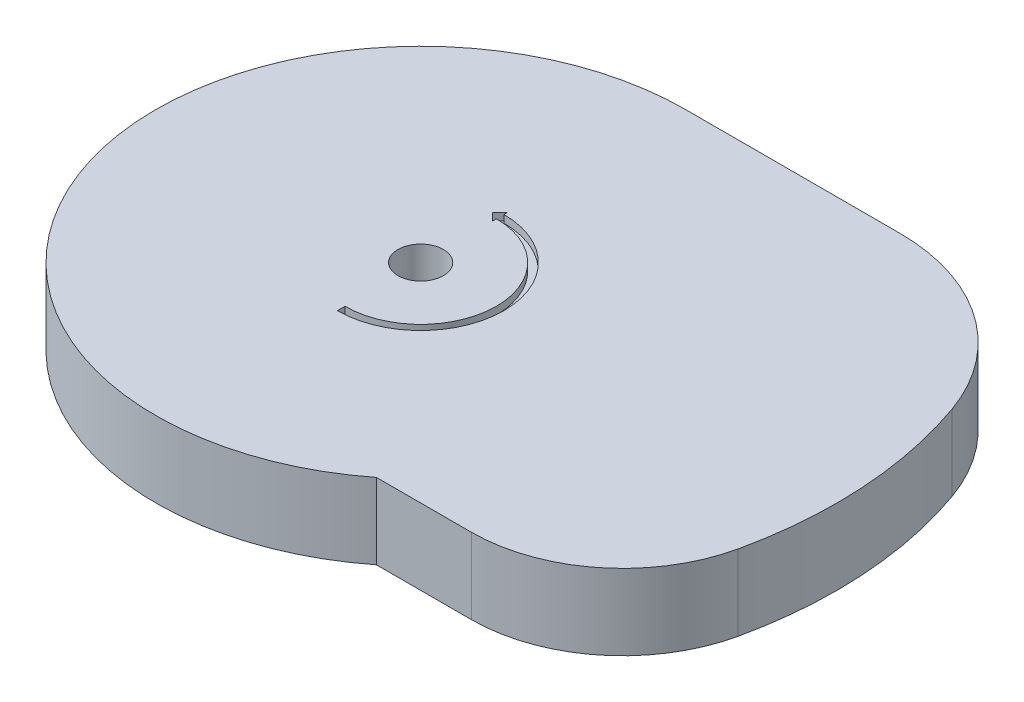
ISO-10303-21;
HEADER;
FILE_DESCRIPTION(('STEP AP214'),'2;1');
FILE_NAME('part.step','',(''),(''),'','','');
FILE_SCHEMA(('AUTOMOTIVE_DESIGN { 1 0 10303 214 1 1 1 1 }'));
ENDSEC;
DATA;
#1=APPLICATION_CONTEXT('core data for automotive mechanical design processes');
#2=APPLICATION_PROTOCOL_DEFINITION('international standard','automotive_design',2000,#1);
#3=PRODUCT_CONTEXT('',#1,'mechanical');
#4=PRODUCT('Part','Part','',(#3));
#5=PRODUCT_RELATED_PRODUCT_CATEGORY('part','',(#4));
#6=PRODUCT_DEFINITION_FORMATION('','',#4);
#7=PRODUCT_DEFINITION_CONTEXT('part definition',#1,'design');
#8=PRODUCT_DEFINITION('design','',#6,#7);
#9=PRODUCT_DEFINITION_SHAPE('','',#8);
#10=(LENGTH_UNIT() NAMED_UNIT(*) SI_UNIT(.MILLI.,.METRE.));
#11=(NAMED_UNIT(*) PLANE_ANGLE_UNIT() SI_UNIT($,.RADIAN.));
#12=(NAMED_UNIT(*) SI_UNIT($,.STERADIAN.) SOLID_ANGLE_UNIT());
#13=UNCERTAINTY_MEASURE_WITH_UNIT(LENGTH_MEASURE(1.E-05),#10,'distance_accuracy_value','');
#14=(GEOMETRIC_REPRESENTATION_CONTEXT(3) GLOBAL_UNCERTAINTY_ASSIGNED_CONTEXT((#13)) GLOBAL_UNIT_ASSIGNED_CONTEXT((#10,
#11,#12)) REPRESENTATION_CONTEXT('',''));
#15=CARTESIAN_POINT('',(0.,0.,0.));
#16=DIRECTION('',(0.,0.,1.));
#17=DIRECTION('',(1.,0.,0.));
#18=AXIS2_PLACEMENT_3D('',#15,#16,#17);
#19=CARTESIAN_POINT('',(34.1869858279433,10.,7.50000000000009));
#20=DIRECTION('',(0.,1.,0.));
#21=DIRECTION('',(0.,0.,1.));
#22=AXIS2_PLACEMENT_3D('',#19,#20,#21);
#23=PLANE('',#22);
#24=CARTESIAN_POINT('',(0.,10.,0.));
#25=DIRECTION('',(0.,-1.,0.));
#26=DIRECTION('',(0.,0.,1.));
#27=AXIS2_PLACEMENT_3D('',#24,#25,#26);
#28=CIRCLE('',#27,10.);
#29=CARTESIAN_POINT('',(0.,10.,-10.));
#30=VERTEX_POINT('',#29);
#31=CARTESIAN_POINT('',(0.,10.,10.));
#32=VERTEX_POINT('',#31);
#33=EDGE_CURVE('E52',#30,#32,#28,.T.);
#34=ORIENTED_EDGE('',*,*,#33,.F.);
#35=DIRECTION('',(0.,0.,-1.));
#36=VECTOR('',#35,1.);
#37=CARTESIAN_POINT('',(0.,10.,-9.5));
#38=LINE('',#37,#36);
#39=CARTESIAN_POINT('',(0.,10.,-9.5));
#40=VERTEX_POINT('',#39);
#41=EDGE_CURVE('E189',#40,#30,#38,.T.);
#42=ORIENTED_EDGE('',*,*,#41,.F.);
#43=DIRECTION('',(0.707106781186548,0.,0.707106781186547));
#44=VECTOR('',#43,1.);
#45=CARTESIAN_POINT('',(-1.,10.,-10.5));
#46=LINE('',#45,#44);
#47=CARTESIAN_POINT('',(-1.,10.,-10.5));
#48=VERTEX_POINT('',#47);
#49=EDGE_CURVE('E193',#48,#40,#46,.T.);
#50=ORIENTED_EDGE('',*,*,#49,.F.);
#51=DIRECTION('',(-0.707106781186548,0.,0.707106781186547));
#52=VECTOR('',#51,1.);
#53=CARTESIAN_POINT('',(0.,10.,-11.5));
#54=LINE('',#53,#52);
#55=CARTESIAN_POINT('',(0.,10.,-11.5));
#56=VERTEX_POINT('',#55);
#57=EDGE_CURVE('E196',#56,#48,#54,.T.);
#58=ORIENTED_EDGE('',*,*,#57,.F.);
#59=DIRECTION('',(0.,0.,-1.));
#60=VECTOR('',#59,1.);
#61=CARTESIAN_POINT('',(0.,10.,-11.));
#62=LINE('',#61,#60);
#63=CARTESIAN_POINT('',(0.,10.,-11.));
#64=VERTEX_POINT('',#63);
#65=EDGE_CURVE('E199',#64,#56,#62,.T.);
#66=ORIENTED_EDGE('',*,*,#65,.F.);
#67=CARTESIAN_POINT('',(0.,10.,0.));
#68=DIRECTION('',(0.,1.,0.));
#69=DIRECTION('',(0.,0.,1.));
#70=AXIS2_PLACEMENT_3D('',#67,#68,#69);
#71=CIRCLE('',#70,11.);
#72=CARTESIAN_POINT('',(0.,10.,11.));
#73=VERTEX_POINT('',#72);
#74=EDGE_CURVE('E202',#73,#64,#71,.T.);
#75=ORIENTED_EDGE('',*,*,#74,.F.);
#76=DIRECTION('',(0.,0.,1.));
#77=VECTOR('',#76,1.);
#78=CARTESIAN_POINT('',(0.,10.,10.));
#79=LINE('',#78,#77);
#80=EDGE_CURVE('E205',#32,#73,#79,.T.);
#81=ORIENTED_EDGE('',*,*,#80,.F.);
#82=EDGE_LOOP('',(#34,#42,#50,#58,#66,#75,#81));
#83=FACE_BOUND('',#82,.T.);
#84=CARTESIAN_POINT('',(34.1869858279433,10.,7.50000000000009));
#85=DIRECTION('',(0.,1.,0.));
#86=DIRECTION('',(0.,0.,1.));
#87=AXIS2_PLACEMENT_3D('',#84,#85,#86);
#88=CIRCLE('',#87,20.);
#89=CARTESIAN_POINT('',(34.1869858279431,10.,27.5000000000001));
#90=VERTEX_POINT('',#89);
#91=CARTESIAN_POINT('',(53.7224063010538,10.,11.7857142857144));
#92=VERTEX_POINT('',#91);
#93=EDGE_CURVE('E146',#90,#92,#88,.T.);
#94=ORIENTED_EDGE('',*,*,#93,.T.);
#95=CARTESIAN_POINT('',(0.,10.,0.));
#96=DIRECTION('',(0.,1.,0.));
#97=DIRECTION('',(0.,0.,1.));
#98=AXIS2_PLACEMENT_3D('',#95,#96,#97);
#99=CIRCLE('',#98,55.);
#100=CARTESIAN_POINT('',(51.8544972870135,10.,-18.3333333333333));
#101=VERTEX_POINT('',#100);
#102=EDGE_CURVE('E96',#92,#101,#99,.T.);
#103=ORIENTED_EDGE('',*,*,#102,.T.);
#104=CARTESIAN_POINT('',(28.2842712474619,10.,-10.));
#105=DIRECTION('',(0.,1.,0.));
#106=DIRECTION('',(0.,0.,-1.));
#107=AXIS2_PLACEMENT_3D('',#104,#105,#106);
#108=CIRCLE('',#107,25.);
#109=CARTESIAN_POINT('',(28.2842712474619,10.,-35.));
#110=VERTEX_POINT('',#109);
#111=EDGE_CURVE('E113',#101,#110,#108,.T.);
#112=ORIENTED_EDGE('',*,*,#111,.T.);
#113=DIRECTION('',(-1.,0.,0.));
#114=VECTOR('',#113,1.);
#115=CARTESIAN_POINT('',(0.,10.,-35.));
#116=LINE('',#115,#114);
#117=CARTESIAN_POINT('',(0.,10.,-35.));
#118=VERTEX_POINT('',#117);
#119=EDGE_CURVE('E106',#110,#118,#116,.T.);
#120=ORIENTED_EDGE('',*,*,#119,.T.);
#121=CARTESIAN_POINT('',(0.,10.,0.));
#122=DIRECTION('',(0.,1.,0.));
#123=DIRECTION('',(0.,0.,1.));
#124=AXIS2_PLACEMENT_3D('',#121,#122,#123);
#125=CIRCLE('',#124,35.);
#126=CARTESIAN_POINT('',(21.650635094611,10.,27.5));
#127=VERTEX_POINT('',#126);
#128=EDGE_CURVE('E110',#118,#127,#125,.T.);
#129=ORIENTED_EDGE('',*,*,#128,.T.);
#130=DIRECTION('',(1.,0.,0.));
#131=VECTOR('',#130,1.);
#132=CARTESIAN_POINT('',(34.1869858279431,10.,27.5000000000001));
#133=LINE('',#132,#131);
#134=EDGE_CURVE('E61',#127,#90,#133,.T.);
#135=ORIENTED_EDGE('',*,*,#134,.T.);
#136=EDGE_LOOP('',(#94,#103,#112,#120,#129,#135));
#137=FACE_BOUND('',#136,.T.);
#138=CARTESIAN_POINT('',(0.,10.,0.));
#139=DIRECTION('',(0.,1.,0.));
#140=DIRECTION('',(0.,0.,1.));
#141=AXIS2_PLACEMENT_3D('',#138,#139,#140);
#142=CIRCLE('',#141,3.);
#143=CARTESIAN_POINT('',(0.,10.,3.));
#144=VERTEX_POINT('',#143);
#145=EDGE_CURVE('E138',#144,#144,#142,.T.);
#146=ORIENTED_EDGE('',*,*,#145,.F.);
#147=EDGE_LOOP('',(#146));
#148=FACE_BOUND('',#147,.T.);
#149=ADVANCED_FACE('F37',(#83,#137,#148),#23,.T.);
#150=CARTESIAN_POINT('',(34.1869858279433,0.,7.50000000000009));
#151=DIRECTION('',(0.,1.,0.));
#152=DIRECTION('',(0.,0.,1.));
#153=AXIS2_PLACEMENT_3D('',#150,#151,#152);
#154=PLANE('',#153);
#155=CARTESIAN_POINT('',(34.1869858279433,0.,7.50000000000009));
#156=DIRECTION('',(0.,1.,0.));
#157=DIRECTION('',(0.,0.,1.));
#158=AXIS2_PLACEMENT_3D('',#155,#156,#157);
#159=CIRCLE('',#158,20.);
#160=CARTESIAN_POINT('',(34.1869858279431,0.,27.5000000000001));
#161=VERTEX_POINT('',#160);
#162=CARTESIAN_POINT('',(53.7224063010538,0.,11.7857142857144));
#163=VERTEX_POINT('',#162);
#164=EDGE_CURVE('E134',#161,#163,#159,.T.);
#165=ORIENTED_EDGE('',*,*,#164,.F.);
#166=DIRECTION('',(1.,0.,0.));
#167=VECTOR('',#166,1.);
#168=CARTESIAN_POINT('',(34.1869858279431,0.,27.5000000000001));
#169=LINE('',#168,#167);
#170=CARTESIAN_POINT('',(21.650635094611,0.,27.5));
#171=VERTEX_POINT('',#170);
#172=EDGE_CURVE('E88',#171,#161,#169,.T.);
#173=ORIENTED_EDGE('',*,*,#172,.F.);
#174=CARTESIAN_POINT('',(0.,0.,0.));
#175=DIRECTION('',(0.,1.,0.));
#176=DIRECTION('',(0.,0.,1.));
#177=AXIS2_PLACEMENT_3D('',#174,#175,#176);
#178=CIRCLE('',#177,35.);
#179=CARTESIAN_POINT('',(0.,0.,-35.));
#180=VERTEX_POINT('',#179);
#181=EDGE_CURVE('E143',#180,#171,#178,.T.);
#182=ORIENTED_EDGE('',*,*,#181,.F.);
#183=DIRECTION('',(-1.,0.,0.));
#184=VECTOR('',#183,1.);
#185=CARTESIAN_POINT('',(0.,0.,-35.));
#186=LINE('',#185,#184);
#187=CARTESIAN_POINT('',(28.2842712474619,0.,-35.));
#188=VERTEX_POINT('',#187);
#189=EDGE_CURVE('E122',#188,#180,#186,.T.);
#190=ORIENTED_EDGE('',*,*,#189,.F.);
#191=CARTESIAN_POINT('',(28.2842712474619,0.,-10.));
#192=DIRECTION('',(0.,1.,0.));
#193=DIRECTION('',(0.,0.,-1.));
#194=AXIS2_PLACEMENT_3D('',#191,#192,#193);
#195=CIRCLE('',#194,25.);
#196=CARTESIAN_POINT('',(51.8544972870135,0.,-18.3333333333333));
#197=VERTEX_POINT('',#196);
#198=EDGE_CURVE('E140',#197,#188,#195,.T.);
#199=ORIENTED_EDGE('',*,*,#198,.F.);
#200=CARTESIAN_POINT('',(0.,0.,0.));
#201=DIRECTION('',(0.,1.,0.));
#202=DIRECTION('',(0.,0.,1.));
#203=AXIS2_PLACEMENT_3D('',#200,#201,#202);
#204=CIRCLE('',#203,55.);
#205=EDGE_CURVE('E137',#163,#197,#204,.T.);
#206=ORIENTED_EDGE('',*,*,#205,.F.);
#207=EDGE_LOOP('',(#165,#173,#182,#190,#199,#206));
#208=FACE_BOUND('',#207,.T.);
#209=CARTESIAN_POINT('',(0.,0.,0.));
#210=DIRECTION('',(0.,1.,0.));
#211=DIRECTION('',(0.,0.,1.));
#212=AXIS2_PLACEMENT_3D('',#209,#210,#211);
#213=CIRCLE('',#212,3.);
#214=CARTESIAN_POINT('',(0.,0.,3.));
#215=VERTEX_POINT('',#214);
#216=EDGE_CURVE('E164',#215,#215,#213,.T.);
#217=ORIENTED_EDGE('',*,*,#216,.T.);
#218=EDGE_LOOP('',(#217));
#219=FACE_BOUND('',#218,.T.);
#220=ADVANCED_FACE('F155',(#208,#219),#154,.F.);
#221=CARTESIAN_POINT('',(34.1869858279433,10.,7.50000000000009));
#222=DIRECTION('',(0.,-1.,0.));
#223=DIRECTION('',(0.,0.,-1.));
#224=AXIS2_PLACEMENT_3D('',#221,#222,#223);
#225=CYLINDRICAL_SURFACE('',#224,20.);
#226=ORIENTED_EDGE('',*,*,#164,.T.);
#227=DIRECTION('',(0.,-1.,0.));
#228=VECTOR('',#227,1.);
#229=CARTESIAN_POINT('',(53.7224063010538,10.,11.7857142857144));
#230=LINE('',#229,#228);
#231=EDGE_CURVE('E11',#92,#163,#230,.T.);
#232=ORIENTED_EDGE('',*,*,#231,.F.);
#233=ORIENTED_EDGE('',*,*,#93,.F.);
#234=DIRECTION('',(0.,-1.,0.));
#235=VECTOR('',#234,1.);
#236=CARTESIAN_POINT('',(34.1869858279431,10.,27.5000000000001));
#237=LINE('',#236,#235);
#238=EDGE_CURVE('E130',#90,#161,#237,.T.);
#239=ORIENTED_EDGE('',*,*,#238,.T.);
#240=EDGE_LOOP('',(#226,#232,#233,#239));
#241=FACE_BOUND('',#240,.T.);
#242=ADVANCED_FACE('F39',(#241),#225,.T.);
#243=CARTESIAN_POINT('',(0.,10.,0.));
#244=DIRECTION('',(0.,-1.,0.));
#245=DIRECTION('',(0.,0.,-1.));
#246=AXIS2_PLACEMENT_3D('',#243,#244,#245);
#247=CYLINDRICAL_SURFACE('',#246,55.);
#248=ORIENTED_EDGE('',*,*,#205,.T.);
#249=DIRECTION('',(0.,-1.,0.));
#250=VECTOR('',#249,1.);
#251=CARTESIAN_POINT('',(51.8544972870135,10.,-18.3333333333333));
#252=LINE('',#251,#250);
#253=EDGE_CURVE('E45',#101,#197,#252,.T.);
#254=ORIENTED_EDGE('',*,*,#253,.F.);
#255=ORIENTED_EDGE('',*,*,#102,.F.);
#256=ORIENTED_EDGE('',*,*,#231,.T.);
#257=EDGE_LOOP('',(#248,#254,#255,#256));
#258=FACE_BOUND('',#257,.T.);
#259=ADVANCED_FACE('F309',(#258),#247,.T.);
#260=CARTESIAN_POINT('',(28.2842712474619,10.,-10.));
#261=DIRECTION('',(0.,-1.,0.));
#262=DIRECTION('',(0.,0.,-1.));
#263=AXIS2_PLACEMENT_3D('',#260,#261,#262);
#264=CYLINDRICAL_SURFACE('',#263,25.);
#265=ORIENTED_EDGE('',*,*,#198,.T.);
#266=DIRECTION('',(0.,-1.,0.));
#267=VECTOR('',#266,1.);
#268=CARTESIAN_POINT('',(28.2842712474619,10.,-35.));
#269=LINE('',#268,#267);
#270=EDGE_CURVE('E125',#110,#188,#269,.T.);
#271=ORIENTED_EDGE('',*,*,#270,.F.);
#272=ORIENTED_EDGE('',*,*,#111,.F.);
#273=ORIENTED_EDGE('',*,*,#253,.T.);
#274=EDGE_LOOP('',(#265,#271,#272,#273));
#275=FACE_BOUND('',#274,.T.);
#276=ADVANCED_FACE('F152',(#275),#264,.T.);
#277=CARTESIAN_POINT('',(0.,10.,-35.));
#278=DIRECTION('',(0.,0.,1.));
#279=DIRECTION('',(1.,0.,0.));
#280=AXIS2_PLACEMENT_3D('',#277,#278,#279);
#281=PLANE('',#280);
#282=ORIENTED_EDGE('',*,*,#189,.T.);
#283=DIRECTION('',(0.,-1.,0.));
#284=VECTOR('',#283,1.);
#285=CARTESIAN_POINT('',(0.,10.,-35.));
#286=LINE('',#285,#284);
#287=EDGE_CURVE('E119',#118,#180,#286,.T.);
#288=ORIENTED_EDGE('',*,*,#287,.F.);
#289=ORIENTED_EDGE('',*,*,#119,.F.);
#290=ORIENTED_EDGE('',*,*,#270,.T.);
#291=EDGE_LOOP('',(#282,#288,#289,#290));
#292=FACE_BOUND('',#291,.T.);
#293=ADVANCED_FACE('F120',(#292),#281,.F.);
#294=CARTESIAN_POINT('',(0.,10.,0.));
#295=DIRECTION('',(0.,-1.,0.));
#296=DIRECTION('',(0.,0.,-1.));
#297=AXIS2_PLACEMENT_3D('',#294,#295,#296);
#298=CYLINDRICAL_SURFACE('',#297,35.);
#299=ORIENTED_EDGE('',*,*,#181,.T.);
#300=DIRECTION('',(0.,-1.,0.));
#301=VECTOR('',#300,1.);
#302=CARTESIAN_POINT('',(21.650635094611,10.,27.5));
#303=LINE('',#302,#301);
#304=EDGE_CURVE('E126',#127,#171,#303,.T.);
#305=ORIENTED_EDGE('',*,*,#304,.F.);
#306=ORIENTED_EDGE('',*,*,#128,.F.);
#307=ORIENTED_EDGE('',*,*,#287,.T.);
#308=EDGE_LOOP('',(#299,#305,#306,#307));
#309=FACE_BOUND('',#308,.T.);
#310=ADVANCED_FACE('F128',(#309),#298,.T.);
#311=CARTESIAN_POINT('',(34.1869858279431,10.,27.5000000000001));
#312=DIRECTION('',(0.,0.,-1.));
#313=DIRECTION('',(-1.,0.,0.));
#314=AXIS2_PLACEMENT_3D('',#311,#312,#313);
#315=PLANE('',#314);
#316=ORIENTED_EDGE('',*,*,#172,.T.);
#317=ORIENTED_EDGE('',*,*,#238,.F.);
#318=ORIENTED_EDGE('',*,*,#134,.F.);
#319=ORIENTED_EDGE('',*,*,#304,.T.);
#320=EDGE_LOOP('',(#316,#317,#318,#319));
#321=FACE_BOUND('',#320,.T.);
#322=ADVANCED_FACE('F157',(#321),#315,.F.);
#323=CARTESIAN_POINT('',(0.,10.,0.));
#324=DIRECTION('',(0.,-1.,0.));
#325=DIRECTION('',(0.,0.,-1.));
#326=AXIS2_PLACEMENT_3D('',#323,#324,#325);
#327=CYLINDRICAL_SURFACE('',#326,3.);
#328=ORIENTED_EDGE('',*,*,#145,.T.);
#329=EDGE_LOOP('',(#328));
#330=FACE_BOUND('',#329,.T.);
#331=ORIENTED_EDGE('',*,*,#216,.F.);
#332=EDGE_LOOP('',(#331));
#333=FACE_BOUND('',#332,.T.);
#334=ADVANCED_FACE('F299',(#330,#333),#327,.F.);
#335=CARTESIAN_POINT('',(0.,9.,0.));
#336=DIRECTION('',(0.,1.,0.));
#337=DIRECTION('',(0.,0.,1.));
#338=AXIS2_PLACEMENT_3D('',#335,#336,#337);
#339=CYLINDRICAL_SURFACE('',#338,10.);
#340=ORIENTED_EDGE('',*,*,#33,.T.);
#341=DIRECTION('',(0.,1.,0.));
#342=VECTOR('',#341,1.);
#343=CARTESIAN_POINT('',(0.,9.,10.));
#344=LINE('',#343,#342);
#345=CARTESIAN_POINT('',(0.,9.,10.));
#346=VERTEX_POINT('',#345);
#347=EDGE_CURVE('E170',#346,#32,#344,.T.);
#348=ORIENTED_EDGE('',*,*,#347,.F.);
#349=CARTESIAN_POINT('',(0.,9.,0.));
#350=DIRECTION('',(0.,-1.,0.));
#351=DIRECTION('',(0.,0.,1.));
#352=AXIS2_PLACEMENT_3D('',#349,#350,#351);
#353=CIRCLE('',#352,10.);
#354=CARTESIAN_POINT('',(0.,9.,-10.));
#355=VERTEX_POINT('',#354);
#356=EDGE_CURVE('E192',#355,#346,#353,.T.);
#357=ORIENTED_EDGE('',*,*,#356,.F.);
#358=DIRECTION('',(0.,1.,0.));
#359=VECTOR('',#358,1.);
#360=CARTESIAN_POINT('',(0.,9.,-10.));
#361=LINE('',#360,#359);
#362=EDGE_CURVE('E167',#355,#30,#361,.T.);
#363=ORIENTED_EDGE('',*,*,#362,.T.);
#364=EDGE_LOOP('',(#340,#348,#357,#363));
#365=FACE_BOUND('',#364,.T.);
#366=ADVANCED_FACE('F235',(#365),#339,.T.);
#367=CARTESIAN_POINT('',(0.,9.,-9.5));
#368=DIRECTION('',(1.,0.,0.));
#369=DIRECTION('',(0.,0.,-1.));
#370=AXIS2_PLACEMENT_3D('',#367,#368,#369);
#371=PLANE('',#370);
#372=ORIENTED_EDGE('',*,*,#41,.T.);
#373=ORIENTED_EDGE('',*,*,#362,.F.);
#374=DIRECTION('',(0.,0.,-1.));
#375=VECTOR('',#374,1.);
#376=CARTESIAN_POINT('',(0.,9.,-9.5));
#377=LINE('',#376,#375);
#378=CARTESIAN_POINT('',(0.,9.,-9.5));
#379=VERTEX_POINT('',#378);
#380=EDGE_CURVE('E173',#379,#355,#377,.T.);
#381=ORIENTED_EDGE('',*,*,#380,.F.);
#382=DIRECTION('',(0.,1.,0.));
#383=VECTOR('',#382,1.);
#384=CARTESIAN_POINT('',(0.,9.,-9.5));
#385=LINE('',#384,#383);
#386=EDGE_CURVE('E185',#379,#40,#385,.T.);
#387=ORIENTED_EDGE('',*,*,#386,.T.);
#388=EDGE_LOOP('',(#372,#373,#381,#387));
#389=FACE_BOUND('',#388,.T.);
#390=ADVANCED_FACE('F253',(#389),#371,.F.);
#391=CARTESIAN_POINT('',(-1.,9.,-10.5));
#392=DIRECTION('',(-0.707106781186547,0.,0.707106781186548));
#393=DIRECTION('',(0.707106781186548,0.,0.707106781186547));
#394=AXIS2_PLACEMENT_3D('',#391,#392,#393);
#395=PLANE('',#394);
#396=ORIENTED_EDGE('',*,*,#49,.T.);
#397=ORIENTED_EDGE('',*,*,#386,.F.);
#398=DIRECTION('',(0.707106781186548,0.,0.707106781186547));
#399=VECTOR('',#398,1.);
#400=CARTESIAN_POINT('',(-1.,9.,-10.5));
#401=LINE('',#400,#399);
#402=CARTESIAN_POINT('',(-1.,9.,-10.5));
#403=VERTEX_POINT('',#402);
#404=EDGE_CURVE('E211',#403,#379,#401,.T.);
#405=ORIENTED_EDGE('',*,*,#404,.F.);
#406=DIRECTION('',(0.,1.,0.));
#407=VECTOR('',#406,1.);
#408=CARTESIAN_POINT('',(-1.,9.,-10.5));
#409=LINE('',#408,#407);
#410=EDGE_CURVE('E182',#403,#48,#409,.T.);
#411=ORIENTED_EDGE('',*,*,#410,.T.);
#412=EDGE_LOOP('',(#396,#397,#405,#411));
#413=FACE_BOUND('',#412,.T.);
#414=ADVANCED_FACE('F258',(#413),#395,.F.);
#415=CARTESIAN_POINT('',(0.,9.,-11.5));
#416=DIRECTION('',(-0.707106781186547,0.,-0.707106781186548));
#417=DIRECTION('',(-0.707106781186548,0.,0.707106781186547));
#418=AXIS2_PLACEMENT_3D('',#415,#416,#417);
#419=PLANE('',#418);
#420=ORIENTED_EDGE('',*,*,#57,.T.);
#421=ORIENTED_EDGE('',*,*,#410,.F.);
#422=DIRECTION('',(-0.707106781186548,0.,0.707106781186547));
#423=VECTOR('',#422,1.);
#424=CARTESIAN_POINT('',(0.,9.,-11.5));
#425=LINE('',#424,#423);
#426=CARTESIAN_POINT('',(0.,9.,-11.5));
#427=VERTEX_POINT('',#426);
#428=EDGE_CURVE('E214',#427,#403,#425,.T.);
#429=ORIENTED_EDGE('',*,*,#428,.F.);
#430=DIRECTION('',(0.,1.,0.));
#431=VECTOR('',#430,1.);
#432=CARTESIAN_POINT('',(0.,9.,-11.5));
#433=LINE('',#432,#431);
#434=EDGE_CURVE('E179',#427,#56,#433,.T.);
#435=ORIENTED_EDGE('',*,*,#434,.T.);
#436=EDGE_LOOP('',(#420,#421,#429,#435));
#437=FACE_BOUND('',#436,.T.);
#438=ADVANCED_FACE('F281',(#437),#419,.F.);
#439=CARTESIAN_POINT('',(0.,9.,-11.));
#440=DIRECTION('',(1.,0.,0.));
#441=DIRECTION('',(0.,0.,-1.));
#442=AXIS2_PLACEMENT_3D('',#439,#440,#441);
#443=PLANE('',#442);
#444=ORIENTED_EDGE('',*,*,#65,.T.);
#445=ORIENTED_EDGE('',*,*,#434,.F.);
#446=DIRECTION('',(0.,0.,-1.));
#447=VECTOR('',#446,1.);
#448=CARTESIAN_POINT('',(0.,9.,-11.));
#449=LINE('',#448,#447);
#450=CARTESIAN_POINT('',(0.,9.,-11.));
#451=VERTEX_POINT('',#450);
#452=EDGE_CURVE('E217',#451,#427,#449,.T.);
#453=ORIENTED_EDGE('',*,*,#452,.F.);
#454=DIRECTION('',(0.,1.,0.));
#455=VECTOR('',#454,1.);
#456=CARTESIAN_POINT('',(0.,9.,-11.));
#457=LINE('',#456,#455);
#458=EDGE_CURVE('E176',#451,#64,#457,.T.);
#459=ORIENTED_EDGE('',*,*,#458,.T.);
#460=EDGE_LOOP('',(#444,#445,#453,#459));
#461=FACE_BOUND('',#460,.T.);
#462=ADVANCED_FACE('F283',(#461),#443,.F.);
#463=CARTESIAN_POINT('',(0.,9.,0.));
#464=DIRECTION('',(0.,1.,0.));
#465=DIRECTION('',(0.,0.,1.));
#466=AXIS2_PLACEMENT_3D('',#463,#464,#465);
#467=CYLINDRICAL_SURFACE('',#466,11.);
#468=ORIENTED_EDGE('',*,*,#74,.T.);
#469=ORIENTED_EDGE('',*,*,#458,.F.);
#470=CARTESIAN_POINT('',(0.,9.,0.));
#471=DIRECTION('',(0.,1.,0.));
#472=DIRECTION('',(0.,0.,1.));
#473=AXIS2_PLACEMENT_3D('',#470,#471,#472);
#474=CIRCLE('',#473,11.);
#475=CARTESIAN_POINT('',(0.,9.,11.));
#476=VERTEX_POINT('',#475);
#477=EDGE_CURVE('E220',#476,#451,#474,.T.);
#478=ORIENTED_EDGE('',*,*,#477,.F.);
#479=DIRECTION('',(0.,1.,0.));
#480=VECTOR('',#479,1.);
#481=CARTESIAN_POINT('',(0.,9.,11.));
#482=LINE('',#481,#480);
#483=EDGE_CURVE('E172',#476,#73,#482,.T.);
#484=ORIENTED_EDGE('',*,*,#483,.T.);
#485=EDGE_LOOP('',(#468,#469,#478,#484));
#486=FACE_BOUND('',#485,.T.);
#487=ADVANCED_FACE('F273',(#486),#467,.F.);
#488=CARTESIAN_POINT('',(0.,9.,10.));
#489=DIRECTION('',(-1.,0.,0.));
#490=DIRECTION('',(0.,0.,1.));
#491=AXIS2_PLACEMENT_3D('',#488,#489,#490);
#492=PLANE('',#491);
#493=ORIENTED_EDGE('',*,*,#80,.T.);
#494=ORIENTED_EDGE('',*,*,#483,.F.);
#495=DIRECTION('',(0.,0.,1.));
#496=VECTOR('',#495,1.);
#497=CARTESIAN_POINT('',(0.,9.,10.));
#498=LINE('',#497,#496);
#499=EDGE_CURVE('E223',#346,#476,#498,.T.);
#500=ORIENTED_EDGE('',*,*,#499,.F.);
#501=ORIENTED_EDGE('',*,*,#347,.T.);
#502=EDGE_LOOP('',(#493,#494,#500,#501));
#503=FACE_BOUND('',#502,.T.);
#504=ADVANCED_FACE('F267',(#503),#492,.F.);
#505=CARTESIAN_POINT('',(0.,9.,0.));
#506=DIRECTION('',(0.,1.,0.));
#507=DIRECTION('',(0.,0.,1.));
#508=AXIS2_PLACEMENT_3D('',#505,#506,#507);
#509=PLANE('',#508);
#510=ORIENTED_EDGE('',*,*,#356,.T.);
#511=ORIENTED_EDGE('',*,*,#499,.T.);
#512=ORIENTED_EDGE('',*,*,#477,.T.);
#513=ORIENTED_EDGE('',*,*,#452,.T.);
#514=ORIENTED_EDGE('',*,*,#428,.T.);
#515=ORIENTED_EDGE('',*,*,#404,.T.);
#516=ORIENTED_EDGE('',*,*,#380,.T.);
#517=EDGE_LOOP('',(#510,#511,#512,#513,#514,#515,#516));
#518=FACE_BOUND('',#517,.T.);
#519=ADVANCED_FACE('F230',(#518),#509,.T.);
#520=CLOSED_SHELL('',(#149,#220,#242,#259,#276,#293,#310,#322,#334,#366,#390,#414,#438,#462,
#487,#504,#519));
#521=MANIFOLD_SOLID_BREP('B2',#520);
#522=ADVANCED_BREP_SHAPE_REPRESENTATION('',(#18,#521),#14);
#523=SHAPE_DEFINITION_REPRESENTATION(#9,#522);
ENDSEC;
END-ISO-10303-21;
